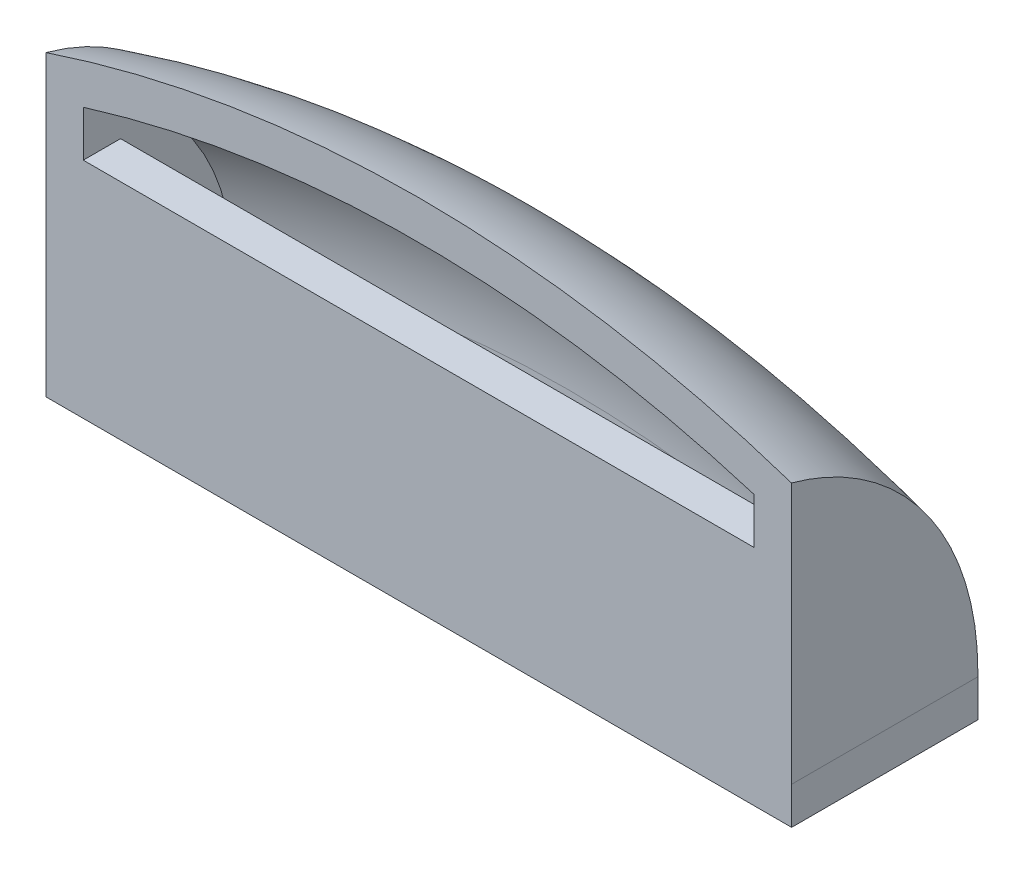
ISO-10303-21;
HEADER;
FILE_DESCRIPTION(('STEP AP214'),'2;1');
FILE_NAME('part.step','',(''),(''),'','','');
FILE_SCHEMA(('AUTOMOTIVE_DESIGN { 1 0 10303 214 1 1 1 1 }'));
ENDSEC;
DATA;
#1=APPLICATION_CONTEXT('core data for automotive mechanical design processes');
#2=APPLICATION_PROTOCOL_DEFINITION('international standard','automotive_design',2000,#1);
#3=PRODUCT_CONTEXT('',#1,'mechanical');
#4=PRODUCT('Part','Part','',(#3));
#5=PRODUCT_RELATED_PRODUCT_CATEGORY('part','',(#4));
#6=PRODUCT_DEFINITION_FORMATION('','',#4);
#7=PRODUCT_DEFINITION_CONTEXT('part definition',#1,'design');
#8=PRODUCT_DEFINITION('design','',#6,#7);
#9=PRODUCT_DEFINITION_SHAPE('','',#8);
#10=(LENGTH_UNIT() NAMED_UNIT(*) SI_UNIT(.MILLI.,.METRE.));
#11=(NAMED_UNIT(*) PLANE_ANGLE_UNIT() SI_UNIT($,.RADIAN.));
#12=(NAMED_UNIT(*) SI_UNIT($,.STERADIAN.) SOLID_ANGLE_UNIT());
#13=UNCERTAINTY_MEASURE_WITH_UNIT(LENGTH_MEASURE(1.E-05),#10,'distance_accuracy_value','');
#14=(GEOMETRIC_REPRESENTATION_CONTEXT(3) GLOBAL_UNCERTAINTY_ASSIGNED_CONTEXT((#13)) GLOBAL_UNIT_ASSIGNED_CONTEXT((#10,
#11,#12)) REPRESENTATION_CONTEXT('',''));
#15=CARTESIAN_POINT('',(0.,0.,0.));
#16=DIRECTION('',(0.,0.,1.));
#17=DIRECTION('',(1.,0.,0.));
#18=AXIS2_PLACEMENT_3D('',#15,#16,#17);
#19=CARTESIAN_POINT('',(-27.,75.,-25.));
#20=DIRECTION('',(1.,0.,0.));
#21=DIRECTION('',(0.,0.,-1.));
#22=AXIS2_PLACEMENT_3D('',#19,#20,#21);
#23=PLANE('',#22);
#24=DIRECTION('',(0.,1.,0.));
#25=VECTOR('',#24,1.);
#26=CARTESIAN_POINT('',(-27.,6.41436476288706,-10.));
#27=LINE('',#26,#25);
#28=CARTESIAN_POINT('',(-27.,90.,-10.));
#29=VERTEX_POINT('',#28);
#30=CARTESIAN_POINT('',(-27.,93.6919210733854,-10.));
#31=VERTEX_POINT('',#30);
#32=EDGE_CURVE('E426',#29,#31,#27,.T.);
#33=ORIENTED_EDGE('',*,*,#32,.F.);
#34=DIRECTION('',(0.,0.,1.));
#35=VECTOR('',#34,1.);
#36=CARTESIAN_POINT('',(-27.,90.,-25.));
#37=LINE('',#36,#35);
#38=CARTESIAN_POINT('',(-27.,90.,-13.));
#39=VERTEX_POINT('',#38);
#40=EDGE_CURVE('E429',#39,#29,#37,.T.);
#41=ORIENTED_EDGE('',*,*,#40,.F.);
#42=DIRECTION('',(0.,1.,0.));
#43=VECTOR('',#42,1.);
#44=CARTESIAN_POINT('',(-27.,75.,-13.));
#45=LINE('',#44,#43);
#46=CARTESIAN_POINT('',(-27.,78.,-13.));
#47=VERTEX_POINT('',#46);
#48=EDGE_CURVE('E421',#47,#39,#45,.T.);
#49=ORIENTED_EDGE('',*,*,#48,.F.);
#50=DIRECTION('',(0.,0.,1.));
#51=VECTOR('',#50,1.);
#52=CARTESIAN_POINT('',(-27.,78.,-25.));
#53=LINE('',#52,#51);
#54=CARTESIAN_POINT('',(-27.,78.,-21.9424375724654));
#55=VERTEX_POINT('',#54);
#56=EDGE_CURVE('E445',#55,#47,#53,.T.);
#57=ORIENTED_EDGE('',*,*,#56,.F.);
#58=CARTESIAN_POINT('',(-27.,93.6919210733854,-10.));
#59=CARTESIAN_POINT('',(-27.,93.619217219464,-10.2257068950183));
#60=CARTESIAN_POINT('',(-27.,93.5416318474032,-10.4498086800089));
#61=CARTESIAN_POINT('',(-27.,93.376862329942,-10.8944452056012));
#62=CARTESIAN_POINT('',(-27.,93.2896785735802,-11.11498009036));
#63=CARTESIAN_POINT('',(-27.,93.0140474152656,-11.7705344006446));
#64=CARTESIAN_POINT('',(-27.,92.8114559576739,-12.1997024041451));
#65=CARTESIAN_POINT('',(-27.,92.3709036193516,-13.0382016320841));
#66=CARTESIAN_POINT('',(-27.,92.133020854741,-13.4475740849002));
#67=CARTESIAN_POINT('',(-27.,91.6235484030225,-14.244803299333));
#68=CARTESIAN_POINT('',(-27.,91.3519576991253,-14.6326594114052));
#69=CARTESIAN_POINT('',(-27.,90.7774660705169,-15.3841327415115));
#70=CARTESIAN_POINT('',(-27.,90.4745800336131,-15.7477613508582));
#71=CARTESIAN_POINT('',(-27.,89.839806520689,-16.4487627542816));
#72=CARTESIAN_POINT('',(-27.,89.5079180895612,-16.7861346829806));
#73=CARTESIAN_POINT('',(-27.,88.8176879448799,-17.4326827015862));
#74=CARTESIAN_POINT('',(-27.,88.4593438371609,-17.7418562339424));
#75=CARTESIAN_POINT('',(-27.,87.7189050233827,-18.3303012762903));
#76=CARTESIAN_POINT('',(-27.,87.3368100171423,-18.6095724082319));
#77=CARTESIAN_POINT('',(-27.,86.5397873173074,-19.1447551441049));
#78=CARTESIAN_POINT('',(-27.,86.1242174957894,-19.3997104160725));
#79=CARTESIAN_POINT('',(-27.,85.2738182067326,-19.8751813038093));
#80=CARTESIAN_POINT('',(-27.,84.8389879082665,-20.0956954318721));
#81=CARTESIAN_POINT('',(-27.,83.9528905578594,-20.5014404681904));
#82=CARTESIAN_POINT('',(-27.,83.5016144924164,-20.6866516705655));
#83=CARTESIAN_POINT('',(-27.,82.5859146213674,-21.0209461565098));
#84=CARTESIAN_POINT('',(-27.,82.1214918206698,-21.1700321931259));
#85=CARTESIAN_POINT('',(-27.,81.2332400060126,-21.4175126709148));
#86=CARTESIAN_POINT('',(-27.,80.8104458949369,-21.5196434850414));
#87=CARTESIAN_POINT('',(-27.,79.9588637858552,-21.6946670524162));
#88=CARTESIAN_POINT('',(-27.,79.5300760448194,-21.767561055206));
#89=CARTESIAN_POINT('',(-27.,78.669385377977,-21.8839539905841));
#90=CARTESIAN_POINT('',(-27.,78.237490076371,-21.9275094738412));
#91=CARTESIAN_POINT('',(-27.,77.3717622157638,-21.9855404497158));
#92=CARTESIAN_POINT('',(-27.,76.937929721892,-22.0000169127175));
#93=CARTESIAN_POINT('',(-27.,76.5041118080434,-22.));
#94=B_SPLINE_CURVE_WITH_KNOTS('',3,(#58,#59,#60,#61,#62,#63,#64,#65,#66,#67,#68,#69,#70,#71,#72,
#73,#74,#75,#76,#77,#78,#79,#80,#81,#82,#83,#84,#85,#86,#87,#88,#89,#90,#91,#92,#93),
.UNSPECIFIED.,.F.,.F.,(4,2,2,2,2,2,2,2,2,2,2,2,2,2,2,2,2,4),(0.,0.711265521087366,
1.42250222399561,2.84435069189139,4.26309764826309,5.68188741108903,7.10000530834543,
8.51816992470458,9.9364630387256,11.3547740818162,12.8157829152158,14.2768548403428,
15.7387399538586,17.2005136241534,18.5043666925197,19.8081640300454,21.1094410213714,
22.4106745875885),.UNSPECIFIED.);
#95=EDGE_CURVE('E272',#31,#55,#94,.T.);
#96=ORIENTED_EDGE('',*,*,#95,.F.);
#97=EDGE_LOOP('',(#33,#41,#49,#57,#96));
#98=FACE_BOUND('',#97,.T.);
#99=ADVANCED_FACE('F37',(#98),#23,.T.);
#100=CARTESIAN_POINT('',(27.,75.,-25.));
#101=DIRECTION('',(-1.,0.,0.));
#102=DIRECTION('',(0.,0.,1.));
#103=AXIS2_PLACEMENT_3D('',#100,#101,#102);
#104=PLANE('',#103);
#105=DIRECTION('',(0.,-1.,0.));
#106=VECTOR('',#105,1.);
#107=CARTESIAN_POINT('',(27.,75.,-13.));
#108=LINE('',#107,#106);
#109=CARTESIAN_POINT('',(27.,90.,-13.));
#110=VERTEX_POINT('',#109);
#111=CARTESIAN_POINT('',(27.,78.,-13.));
#112=VERTEX_POINT('',#111);
#113=EDGE_CURVE('E424',#110,#112,#108,.T.);
#114=ORIENTED_EDGE('',*,*,#113,.F.);
#115=DIRECTION('',(0.,0.,-1.));
#116=VECTOR('',#115,1.);
#117=CARTESIAN_POINT('',(27.,90.,-25.));
#118=LINE('',#117,#116);
#119=CARTESIAN_POINT('',(27.,90.,-10.));
#120=VERTEX_POINT('',#119);
#121=EDGE_CURVE('E427',#120,#110,#118,.T.);
#122=ORIENTED_EDGE('',*,*,#121,.F.);
#123=DIRECTION('',(0.,-1.,0.));
#124=VECTOR('',#123,1.);
#125=CARTESIAN_POINT('',(27.,6.41436476288706,-10.));
#126=LINE('',#125,#124);
#127=CARTESIAN_POINT('',(27.,93.6919210733854,-10.));
#128=VERTEX_POINT('',#127);
#129=EDGE_CURVE('E63',#128,#120,#126,.T.);
#130=ORIENTED_EDGE('',*,*,#129,.F.);
#131=CARTESIAN_POINT('',(27.,76.5041118080434,-22.));
#132=CARTESIAN_POINT('',(27.,77.0346757917918,-22.0000333245405));
#133=CARTESIAN_POINT('',(27.,77.5652439063847,-21.9783710890752));
#134=CARTESIAN_POINT('',(27.,78.6229095243907,-21.8915178521918));
#135=CARTESIAN_POINT('',(27.,79.1500062905515,-21.8263178872294));
#136=CARTESIAN_POINT('',(27.,80.1979622909298,-21.6520962402332));
#137=CARTESIAN_POINT('',(27.,80.7188087276313,-21.5429966296942));
#138=CARTESIAN_POINT('',(27.,81.4915986506471,-21.3467077874211));
#139=CARTESIAN_POINT('',(27.,81.7477833054238,-21.275837818185));
#140=CARTESIAN_POINT('',(27.,82.2569773349279,-21.1232441960247));
#141=CARTESIAN_POINT('',(27.,82.5099857984201,-21.0415175028746));
#142=CARTESIAN_POINT('',(27.,83.264190862016,-20.7798980926446));
#143=CARTESIAN_POINT('',(27.,83.7598602925032,-20.5837451634038));
#144=CARTESIAN_POINT('',(27.,84.7321833192771,-20.1490560776574));
#145=CARTESIAN_POINT('',(27.,85.2088373479439,-19.910520885531));
#146=CARTESIAN_POINT('',(27.,86.1388667512204,-19.3924592004361));
#147=CARTESIAN_POINT('',(27.,86.5922603772987,-19.1129655311783));
#148=CARTESIAN_POINT('',(27.,87.4721677488499,-18.5144743849411));
#149=CARTESIAN_POINT('',(27.,87.8986834139673,-18.1954797339877));
#150=CARTESIAN_POINT('',(27.,88.7031427880431,-17.5346718201943));
#151=CARTESIAN_POINT('',(27.,89.0823896358479,-17.1944431379185));
#152=CARTESIAN_POINT('',(27.,89.8094500580473,-16.4818286977226));
#153=CARTESIAN_POINT('',(27.,90.157266028708,-16.1094453954862));
#154=CARTESIAN_POINT('',(27.,90.6528559009201,-15.5289196944014));
#155=CARTESIAN_POINT('',(27.,90.813676578912,-15.3317812114863));
#156=CARTESIAN_POINT('',(27.,91.1262647459645,-14.9305368303903));
#157=CARTESIAN_POINT('',(27.,91.2780347784153,-14.7264329152094));
#158=CARTESIAN_POINT('',(27.,91.7191995729419,-14.1042714568924));
#159=CARTESIAN_POINT('',(27.,91.9945996372107,-13.6761878939452));
#160=CARTESIAN_POINT('',(27.,92.5471996668486,-12.7243711892247));
#161=CARTESIAN_POINT('',(27.,92.8172761373544,-12.196471080731));
#162=CARTESIAN_POINT('',(27.,93.1785720370115,-11.3858187760741));
#163=CARTESIAN_POINT('',(27.,93.2916527838105,-11.1126166151735));
#164=CARTESIAN_POINT('',(27.,93.5029950332463,-10.560447545539));
#165=CARTESIAN_POINT('',(27.,93.6012521599434,-10.2814789620797));
#166=CARTESIAN_POINT('',(27.,93.6919210733854,-9.99999999999999));
#167=B_SPLINE_CURVE_WITH_KNOTS('',3,(#131,#132,#133,#134,#135,#136,#137,#138,#139,#140,#141,
#142,#143,#144,#145,#146,#147,#148,#149,#150,#151,#152,#153,#154,#155,#156,#157,#158,#159,#160,
#161,#162,#163,#164,#165,#166),.UNSPECIFIED.,.F.,.F.,(4,2,2,2,2,2,2,2,2,2,2,2,2,2,2,2,2,4),(0.,
1.5912406810534,3.18280906765717,4.77721528130844,5.57442663064602,6.37186169683393,
7.96891216325808,9.56592629455348,11.1616675235869,12.7572946540973,14.2838800173625,
15.8103488965604,16.5733740664691,17.3361837925554,18.8611102495762,20.6363229684173,
21.5229949982962,22.4099282641586),.UNSPECIFIED.);
#168=CARTESIAN_POINT('',(27.,78.,-21.9424375724654));
#169=VERTEX_POINT('',#168);
#170=EDGE_CURVE('E281',#169,#128,#167,.T.);
#171=ORIENTED_EDGE('',*,*,#170,.F.);
#172=DIRECTION('',(0.,0.,1.));
#173=VECTOR('',#172,1.);
#174=CARTESIAN_POINT('',(27.,78.,-25.));
#175=LINE('',#174,#173);
#176=EDGE_CURVE('E289',#169,#112,#175,.T.);
#177=ORIENTED_EDGE('',*,*,#176,.T.);
#178=EDGE_LOOP('',(#114,#122,#130,#171,#177));
#179=FACE_BOUND('',#178,.T.);
#180=ADVANCED_FACE('F292',(#179),#104,.T.);
#181=CARTESIAN_POINT('',(0.,78.,-25.));
#182=DIRECTION('',(0.,1.,0.));
#183=DIRECTION('',(0.,0.,1.));
#184=AXIS2_PLACEMENT_3D('',#181,#182,#183);
#185=PLANE('',#184);
#186=CARTESIAN_POINT('',(24.,78.,-19.1524035055864));
#187=DIRECTION('',(0.,-1.,0.));
#188=DIRECTION('',(0.,0.,-1.));
#189=AXIS2_PLACEMENT_3D('',#186,#187,#188);
#190=CIRCLE('',#189,2.5);
#191=CARTESIAN_POINT('',(24.,78.,-21.6524035055864));
#192=VERTEX_POINT('',#191);
#193=EDGE_CURVE('E377',#192,#192,#190,.T.);
#194=ORIENTED_EDGE('',*,*,#193,.T.);
#195=EDGE_LOOP('',(#194));
#196=FACE_BOUND('',#195,.T.);
#197=CARTESIAN_POINT('',(16.,78.,-19.1524035055864));
#198=DIRECTION('',(0.,-1.,0.));
#199=DIRECTION('',(0.,0.,-1.));
#200=AXIS2_PLACEMENT_3D('',#197,#198,#199);
#201=CIRCLE('',#200,2.5);
#202=CARTESIAN_POINT('',(16.,78.,-21.6524035055864));
#203=VERTEX_POINT('',#202);
#204=EDGE_CURVE('E410',#203,#203,#201,.T.);
#205=ORIENTED_EDGE('',*,*,#204,.T.);
#206=EDGE_LOOP('',(#205));
#207=FACE_BOUND('',#206,.T.);
#208=CARTESIAN_POINT('',(-8.,78.,-19.1524035055865));
#209=DIRECTION('',(0.,-1.,0.));
#210=DIRECTION('',(0.,0.,-1.));
#211=AXIS2_PLACEMENT_3D('',#208,#209,#210);
#212=CIRCLE('',#211,2.5);
#213=CARTESIAN_POINT('',(-8.,78.,-21.6524035055865));
#214=VERTEX_POINT('',#213);
#215=EDGE_CURVE('E400',#214,#214,#212,.T.);
#216=ORIENTED_EDGE('',*,*,#215,.T.);
#217=EDGE_LOOP('',(#216));
#218=FACE_BOUND('',#217,.T.);
#219=CARTESIAN_POINT('',(-16.,78.,-19.1524035055865));
#220=DIRECTION('',(0.,-1.,0.));
#221=DIRECTION('',(0.,0.,-1.));
#222=AXIS2_PLACEMENT_3D('',#219,#220,#221);
#223=CIRCLE('',#222,2.5);
#224=CARTESIAN_POINT('',(-16.,78.,-21.6524035055865));
#225=VERTEX_POINT('',#224);
#226=EDGE_CURVE('E385',#225,#225,#223,.T.);
#227=ORIENTED_EDGE('',*,*,#226,.T.);
#228=EDGE_LOOP('',(#227));
#229=FACE_BOUND('',#228,.T.);
#230=CARTESIAN_POINT('',(-24.,78.,-19.1524035055866));
#231=DIRECTION('',(0.,-1.,0.));
#232=DIRECTION('',(0.,0.,-1.));
#233=AXIS2_PLACEMENT_3D('',#230,#231,#232);
#234=CIRCLE('',#233,2.5);
#235=CARTESIAN_POINT('',(-24.,78.,-21.6524035055866));
#236=VERTEX_POINT('',#235);
#237=EDGE_CURVE('E386',#236,#236,#234,.T.);
#238=ORIENTED_EDGE('',*,*,#237,.T.);
#239=EDGE_LOOP('',(#238));
#240=FACE_BOUND('',#239,.T.);
#241=CARTESIAN_POINT('',(8.,78.,-19.1524035055864));
#242=DIRECTION('',(0.,-1.,0.));
#243=DIRECTION('',(0.,0.,-1.));
#244=AXIS2_PLACEMENT_3D('',#241,#242,#243);
#245=CIRCLE('',#244,2.5);
#246=CARTESIAN_POINT('',(8.,78.,-21.6524035055864));
#247=VERTEX_POINT('',#246);
#248=EDGE_CURVE('E392',#247,#247,#245,.T.);
#249=ORIENTED_EDGE('',*,*,#248,.T.);
#250=EDGE_LOOP('',(#249));
#251=FACE_BOUND('',#250,.T.);
#252=CARTESIAN_POINT('',(0.,78.,-19.1524035055864));
#253=DIRECTION('',(0.,-1.,0.));
#254=DIRECTION('',(0.,0.,-1.));
#255=AXIS2_PLACEMENT_3D('',#252,#253,#254);
#256=CIRCLE('',#255,2.5);
#257=CARTESIAN_POINT('',(0.,78.,-21.6524035055864));
#258=VERTEX_POINT('',#257);
#259=EDGE_CURVE('E418',#258,#258,#256,.T.);
#260=ORIENTED_EDGE('',*,*,#259,.T.);
#261=EDGE_LOOP('',(#260));
#262=FACE_BOUND('',#261,.T.);
#263=ORIENTED_EDGE('',*,*,#56,.T.);
#264=DIRECTION('',(1.,0.,0.));
#265=VECTOR('',#264,1.);
#266=CARTESIAN_POINT('',(0.,78.,-13.));
#267=LINE('',#266,#265);
#268=EDGE_CURVE('E11',#47,#112,#267,.T.);
#269=ORIENTED_EDGE('',*,*,#268,.T.);
#270=ORIENTED_EDGE('',*,*,#176,.F.);
#271=CARTESIAN_POINT('',(-40.4373796665936,78.,-20.4431854967379));
#272=CARTESIAN_POINT('',(-40.0745835027086,78.,-20.5252958430657));
#273=CARTESIAN_POINT('',(-39.7108244496125,78.,-20.6030500567686));
#274=CARTESIAN_POINT('',(-38.9816813721348,78.,-20.7503711048823));
#275=CARTESIAN_POINT('',(-38.6162974849392,78.,-20.8199386173759));
#276=CARTESIAN_POINT('',(-37.5184518772257,78.,-21.0170988492007));
#277=CARTESIAN_POINT('',(-36.7839164573891,78.,-21.1332339681303));
#278=CARTESIAN_POINT('',(-35.3130438388249,78.,-21.3385459535695));
#279=CARTESIAN_POINT('',(-34.5767158016866,78.,-21.4277898087633));
#280=CARTESIAN_POINT('',(-33.1015596483565,78.,-21.5832576928411));
#281=CARTESIAN_POINT('',(-32.3627312014544,78.,-21.649478546078));
#282=CARTESIAN_POINT('',(-30.88468059877,78.,-21.7620572424267));
#283=CARTESIAN_POINT('',(-30.1454606018707,78.,-21.808444015093));
#284=CARTESIAN_POINT('',(-28.6661438096076,78.,-21.8845027307482));
#285=CARTESIAN_POINT('',(-27.9260469703664,78.,-21.9141737985298));
#286=CARTESIAN_POINT('',(-26.4448991899436,78.,-21.959612491081));
#287=CARTESIAN_POINT('',(-25.7038479473313,78.,-21.9753698791841));
#288=CARTESIAN_POINT('',(-24.2215833647041,78.,-21.9955638844467));
#289=CARTESIAN_POINT('',(-23.4803700207509,78.,-22.0000001864451));
#290=CARTESIAN_POINT('',(-22.0312490408585,78.,-21.9999998219302));
#291=CARTESIAN_POINT('',(-21.3233409758596,78.,-21.9959527873187));
#292=CARTESIAN_POINT('',(-19.9075845282182,78.,-21.9817599995771));
#293=CARTESIAN_POINT('',(-19.1997361462037,78.,-21.9716141887396));
#294=CARTESIAN_POINT('',(-17.7840857123658,78.,-21.9470848357499));
#295=CARTESIAN_POINT('',(-17.0762836638885,78.,-21.9327011096092));
#296=CARTESIAN_POINT('',(-15.6607359380111,78.,-21.9014182586534));
#297=CARTESIAN_POINT('',(-14.9529902607036,78.,-21.8845191297796));
#298=CARTESIAN_POINT('',(-13.5378644710592,78.,-21.8497867413899));
#299=CARTESIAN_POINT('',(-12.8304843472355,78.,-21.8319539369174));
#300=CARTESIAN_POINT('',(-11.4157124154307,78.,-21.7967537671303));
#301=CARTESIAN_POINT('',(-10.708320607453,78.,-21.7793864016864));
#302=CARTESIAN_POINT('',(-9.29351781522365,78.,-21.7463434626295));
#303=CARTESIAN_POINT('',(-8.58610683218487,78.,-21.730667838253));
#304=CARTESIAN_POINT('',(-7.17122903076485,78.,-21.7020327754913));
#305=CARTESIAN_POINT('',(-6.46376221240883,78.,-21.6890733358865));
#306=CARTESIAN_POINT('',(-5.04758799728329,78.,-21.6666565863968));
#307=CARTESIAN_POINT('',(-4.33888050525951,78.,-21.6572051721121));
#308=CARTESIAN_POINT('',(-2.92142199750249,78.,-21.6424043715684));
#309=CARTESIAN_POINT('',(-2.21267098177971,78.,-21.6370549843267));
#310=CARTESIAN_POINT('',(-0.795152250450454,78.,-21.6307742494973));
#311=CARTESIAN_POINT('',(-0.0863845349359149,78.,-21.629842881563));
#312=CARTESIAN_POINT('',(1.33114253001846,78.,-21.6324527243402));
#313=CARTESIAN_POINT('',(2.03990187945791,78.,-21.6359939352548));
#314=CARTESIAN_POINT('',(3.45807947784727,78.,-21.647346269665));
#315=CARTESIAN_POINT('',(4.16749769270408,78.,-21.6551615691433));
#316=CARTESIAN_POINT('',(5.58628114775214,78.,-21.6745977388534));
#317=CARTESIAN_POINT('',(6.29564638792651,78.,-21.6862186102929));
#318=CARTESIAN_POINT('',(7.71434243982659,78.,-21.7125524060677));
#319=CARTESIAN_POINT('',(8.42367324955509,78.,-21.7272654357669));
#320=CARTESIAN_POINT('',(9.8422863302596,78.,-21.7588388265653));
#321=CARTESIAN_POINT('',(10.5515686012133,78.,-21.7756991886476));
#322=CARTESIAN_POINT('',(11.9756026822028,78.,-21.8105462611486));
#323=CARTESIAN_POINT('',(12.6903542988448,78.,-21.8285406851236));
#324=CARTESIAN_POINT('',(14.1198672909939,78.,-21.8641581484936));
#325=CARTESIAN_POINT('',(14.8346286665045,78.,-21.8817811877526));
#326=CARTESIAN_POINT('',(16.2641465271401,78.,-21.9150983693796));
#327=CARTESIAN_POINT('',(16.9789030089372,78.,-21.930792650041));
#328=CARTESIAN_POINT('',(18.4084889262717,78.,-21.9585371987073));
#329=CARTESIAN_POINT('',(19.1233183617254,78.,-21.9705874708487));
#330=CARTESIAN_POINT('',(20.55098426064,78.,-21.9891521962113));
#331=CARTESIAN_POINT('',(21.2638205027654,78.,-21.9956825745991));
#332=CARTESIAN_POINT('',(22.6895204408151,78.,-22.0012778156343));
#333=CARTESIAN_POINT('',(23.4023841362786,78.,-22.000342772625));
#334=CARTESIAN_POINT('',(24.8283153563948,78.,-21.9888790111914));
#335=CARTESIAN_POINT('',(25.5413828554702,78.,-21.978346644613));
#336=CARTESIAN_POINT('',(26.9672384229693,78.,-21.9454124857918));
#337=CARTESIAN_POINT('',(27.6800264980781,78.,-21.923010997356));
#338=CARTESIAN_POINT('',(29.1066965284859,78.,-21.8638460878125));
#339=CARTESIAN_POINT('',(29.8205771330828,78.,-21.8270491351855));
#340=CARTESIAN_POINT('',(31.2472696706322,78.,-21.7364857233503));
#341=CARTESIAN_POINT('',(31.9600816228532,78.,-21.6827195738962));
#342=CARTESIAN_POINT('',(33.3832694667586,78.,-21.5554767840078));
#343=CARTESIAN_POINT('',(34.0936470588481,78.,-21.4820194667438));
#344=CARTESIAN_POINT('',(35.5116717754108,78.,-21.3123618881089));
#345=CARTESIAN_POINT('',(36.2193190597525,78.,-21.2161629795217));
#346=CARTESIAN_POINT('',(37.6387905994659,78.,-20.996491474965));
#347=CARTESIAN_POINT('',(38.3505686654758,78.,-20.8727166363303));
#348=CARTESIAN_POINT('',(39.7680678387482,78.,-20.5949066350063));
#349=CARTESIAN_POINT('',(40.4737903298521,78.,-20.4408785890794));
#350=CARTESIAN_POINT('',(41.8796774538019,78.,-20.0978532603501));
#351=CARTESIAN_POINT('',(42.5798104912421,78.,-19.9087244384741));
#352=CARTESIAN_POINT('',(43.6214775022799,78.,-19.5957107091333));
#353=CARTESIAN_POINT('',(43.9674303146966,78.,-19.4864306964832));
#354=CARTESIAN_POINT('',(44.6559332965782,78.,-19.2574820554594));
#355=CARTESIAN_POINT('',(44.9984829619861,78.,-19.1378119129822));
#356=CARTESIAN_POINT('',(45.3390555863682,78.,-19.0126481347996));
#357=B_SPLINE_CURVE_WITH_KNOTS('',3,(#271,#272,#273,#274,#275,#276,#277,#278,#279,#280,#281,
#282,#283,#284,#285,#286,#287,#288,#289,#290,#291,#292,#293,#294,#295,#296,#297,#298,#299,#300,
#301,#302,#303,#304,#305,#306,#307,#308,#309,#310,#311,#312,#313,#314,#315,#316,#317,#318,#319,
#320,#321,#322,#323,#324,#325,#326,#327,#328,#329,#330,#331,#332,#333,#334,#335,#336,#337,#338,
#339,#340,#341,#342,#343,#344,#345,#346,#347,#348,#349,#350,#351,#352,#353,#354,#355,#356),
.UNSPECIFIED.,.F.,.F.,(4,2,2,2,2,2,2,2,2,2,2,2,2,2,2,2,2,2,2,2,2,2,2,2,2,2,2,2,2,2,2,2,2,2,2,2,
2,2,2,2,2,2,4),(0.,1.11585212317936,2.23161175813276,4.4619647634316,6.68671492042735,
8.9117718237363,11.1335721443637,13.3554887840462,15.5790387884526,17.8026506922791,
19.926375389799,22.0501201825891,24.1739571910778,26.2977976265646,28.420612435101,
30.5434266537497,32.6661771560454,34.7889267051475,36.9152277725809,39.0415283305989,
41.1678190962463,43.2941099584706,45.4224820267581,47.5508547705682,49.6793000494871,
51.8077463028468,53.952680712389,56.0976159080501,58.242397220411,60.3871760981218,
62.5257458549372,64.6642885859012,66.8036445633367,68.9429457835887,71.087260059946,
73.2315351964609,75.3737137855319,77.5157649791314,79.6825624006486,81.8488507140414,
84.0234273412915,85.1116879487829,86.2001074102602),.UNSPECIFIED.);
#358=CARTESIAN_POINT('',(22.7391615622259,78.,-22.));
#359=VERTEX_POINT('',#358);
#360=EDGE_CURVE('E303',#359,#169,#357,.T.);
#361=ORIENTED_EDGE('',*,*,#360,.F.);
#362=DIRECTION('',(-1.,0.,0.));
#363=VECTOR('',#362,1.);
#364=CARTESIAN_POINT('',(0.,78.,-22.));
#365=LINE('',#364,#363);
#366=CARTESIAN_POINT('',(-22.7391615622259,78.,-22.));
#367=VERTEX_POINT('',#366);
#368=EDGE_CURVE('E451',#359,#367,#365,.T.);
#369=ORIENTED_EDGE('',*,*,#368,.T.);
#370=EDGE_CURVE('E310',#55,#367,#357,.T.);
#371=ORIENTED_EDGE('',*,*,#370,.F.);
#372=EDGE_LOOP('',(#263,#269,#270,#361,#369,#371));
#373=FACE_BOUND('',#372,.T.);
#374=ADVANCED_FACE('F296',(#196,#207,#218,#229,#240,#251,#262,#373),#185,.T.);
#375=CARTESIAN_POINT('',(-30.,75.,-25.));
#376=DIRECTION('',(1.,0.,0.));
#377=DIRECTION('',(0.,0.,-1.));
#378=AXIS2_PLACEMENT_3D('',#375,#376,#377);
#379=PLANE('',#378);
#380=DIRECTION('',(0.,1.,0.));
#381=VECTOR('',#380,1.);
#382=CARTESIAN_POINT('',(-30.,75.,-10.));
#383=LINE('',#382,#381);
#384=CARTESIAN_POINT('',(-30.,72.,-10.));
#385=VERTEX_POINT('',#384);
#386=CARTESIAN_POINT('',(-30.,96.,-10.));
#387=VERTEX_POINT('',#386);
#388=EDGE_CURVE('E318',#385,#387,#383,.T.);
#389=ORIENTED_EDGE('',*,*,#388,.T.);
#390=CARTESIAN_POINT('',(-30.,96.,-10.));
#391=CARTESIAN_POINT('',(-30.,95.9272843587624,-10.267054467892));
#392=CARTESIAN_POINT('',(-30.,95.8487812178515,-10.5324982919286));
#393=CARTESIAN_POINT('',(-30.,95.6803759047896,-11.0597334048184));
#394=CARTESIAN_POINT('',(-30.,95.5904741965683,-11.3215248418454));
#395=CARTESIAN_POINT('',(-30.,95.3040113372372,-12.1005729019031));
#396=CARTESIAN_POINT('',(-30.,95.0906268372256,-12.6117438451124));
#397=CARTESIAN_POINT('',(-30.,94.6214767222097,-13.6128518031679));
#398=CARTESIAN_POINT('',(-30.,94.3658060350915,-14.1028333462248));
#399=CARTESIAN_POINT('',(-30.,93.9520397448517,-14.8201725820242));
#400=CARTESIAN_POINT('',(-30.,93.8090636258165,-15.0563621232062));
#401=CARTESIAN_POINT('',(-30.,93.5132767406698,-15.5225792993039));
#402=CARTESIAN_POINT('',(-30.,93.3604636561917,-15.7526054634167));
#403=CARTESIAN_POINT('',(-30.,92.8880051471077,-16.4324781981741));
#404=CARTESIAN_POINT('',(-30.,92.554105914538,-16.8725250859767));
#405=CARTESIAN_POINT('',(-30.,91.851124952213,-17.723555811852));
#406=CARTESIAN_POINT('',(-30.,91.4820419125056,-18.1345385668251));
#407=CARTESIAN_POINT('',(-30.,90.9043130009514,-18.7273843977736));
#408=CARTESIAN_POINT('',(-30.,90.7076885950296,-18.9210883905472));
#409=CARTESIAN_POINT('',(-30.,90.3068161695663,-19.3003325534084));
#410=CARTESIAN_POINT('',(-30.,90.1025701449409,-19.485874832458));
#411=CARTESIAN_POINT('',(-30.,89.4788511487687,-20.0299964948971));
#412=CARTESIAN_POINT('',(-30.,89.0483755206115,-20.3760929760081));
#413=CARTESIAN_POINT('',(-30.,88.1471439789817,-21.0436962987804));
#414=CARTESIAN_POINT('',(-30.,87.6755367429274,-21.3640501440856));
#415=CARTESIAN_POINT('',(-30.,86.7080962737381,-21.9658311534647));
#416=CARTESIAN_POINT('',(-30.,86.2122624815343,-22.2472574186442));
#417=CARTESIAN_POINT('',(-30.,85.1994301474438,-22.7702799368788));
#418=CARTESIAN_POINT('',(-30.,84.6824110122981,-23.0118362299665));
#419=CARTESIAN_POINT('',(-30.,83.6310712455219,-23.4540048264665));
#420=CARTESIAN_POINT('',(-30.,83.0967494350217,-23.6546143332544));
#421=CARTESIAN_POINT('',(-30.,82.262501201253,-23.9318739537644));
#422=CARTESIAN_POINT('',(-30.,81.967369594489,-24.0232012377724));
#423=CARTESIAN_POINT('',(-30.,81.3736724002996,-24.1936247366981));
#424=CARTESIAN_POINT('',(-30.,81.0751076219679,-24.2727237724463));
#425=CARTESIAN_POINT('',(-30.,80.1748109914703,-24.4916920640192));
#426=CARTESIAN_POINT('',(-30.,79.5685149360106,-24.6132198796222));
#427=CARTESIAN_POINT('',(-30.,78.3492124147324,-24.8071305508758));
#428=CARTESIAN_POINT('',(-30.,77.7362182472481,-24.8795917812271));
#429=CARTESIAN_POINT('',(-30.,76.5066225924859,-24.9760350570654));
#430=CARTESIAN_POINT('',(-30.,75.8900223604652,-25.0000330696926));
#431=CARTESIAN_POINT('',(-30.,75.2734428924554,-25.));
#432=B_SPLINE_CURVE_WITH_KNOTS('',3,(#390,#391,#392,#393,#394,#395,#396,#397,#398,#399,#400,
#401,#402,#403,#404,#405,#406,#407,#408,#409,#410,#411,#412,#413,#414,#415,#416,#417,#418,#419,
#420,#421,#422,#423,#424,#425,#426,#427,#428,#429,#430,#431),.UNSPECIFIED.,.F.,.F.,(4,2,2,2,2,2,
2,2,2,2,2,2,2,2,2,2,2,2,2,2,4),(0.,0.830200604503695,1.66036743010463,3.31995555233074,
4.97586742623799,5.80393487959208,6.63219821070533,8.28732254906213,9.94250853455626,
10.7703452135121,11.5979667101223,13.2531166191606,14.961645765912,16.6702143585071,
18.3804851124916,20.0908726371922,21.0174574643832,21.9438282256395,23.7966897732162,
25.6465846948834,27.4958700335488),.UNSPECIFIED.);
#433=CARTESIAN_POINT('',(-30.,75.2734428924554,-25.));
#434=VERTEX_POINT('',#433);
#435=EDGE_CURVE('E47',#387,#434,#432,.T.);
#436=ORIENTED_EDGE('',*,*,#435,.T.);
#437=DIRECTION('',(0.,1.,0.));
#438=VECTOR('',#437,1.);
#439=CARTESIAN_POINT('',(-30.,75.,-25.));
#440=LINE('',#439,#438);
#441=CARTESIAN_POINT('',(-30.,72.,-25.));
#442=VERTEX_POINT('',#441);
#443=EDGE_CURVE('E313',#442,#434,#440,.T.);
#444=ORIENTED_EDGE('',*,*,#443,.F.);
#445=DIRECTION('',(0.,0.,-1.));
#446=VECTOR('',#445,1.);
#447=CARTESIAN_POINT('',(-30.,72.,-25.));
#448=LINE('',#447,#446);
#449=EDGE_CURVE('E166',#385,#442,#448,.T.);
#450=ORIENTED_EDGE('',*,*,#449,.F.);
#451=EDGE_LOOP('',(#389,#436,#444,#450));
#452=FACE_BOUND('',#451,.T.);
#453=ADVANCED_FACE('F300',(#452),#379,.F.);
#454=CARTESIAN_POINT('',(30.,75.,-25.));
#455=DIRECTION('',(-1.,0.,0.));
#456=DIRECTION('',(0.,0.,1.));
#457=AXIS2_PLACEMENT_3D('',#454,#455,#456);
#458=PLANE('',#457);
#459=DIRECTION('',(0.,-1.,0.));
#460=VECTOR('',#459,1.);
#461=CARTESIAN_POINT('',(30.,75.,-25.));
#462=LINE('',#461,#460);
#463=CARTESIAN_POINT('',(30.,75.2734428924554,-25.));
#464=VERTEX_POINT('',#463);
#465=CARTESIAN_POINT('',(30.0045510411343,75.,-25.));
#466=VERTEX_POINT('',#465);
#467=EDGE_CURVE('E316',#464,#466,#462,.T.);
#468=ORIENTED_EDGE('',*,*,#467,.F.);
#469=CARTESIAN_POINT('',(30.,75.2734428924554,-25.));
#470=CARTESIAN_POINT('',(30.,75.9125833850177,-25.0000461212636));
#471=CARTESIAN_POINT('',(30.,76.5517874736002,-24.9742508507845));
#472=CARTESIAN_POINT('',(30.,77.8261373276366,-24.8705855867161));
#473=CARTESIAN_POINT('',(30.,78.4612818504508,-24.7927003529984));
#474=CARTESIAN_POINT('',(30.,79.7245890523722,-24.5841918591141));
#475=CARTESIAN_POINT('',(30.,80.3527292671145,-24.4534319150299));
#476=CARTESIAN_POINT('',(30.,81.5956419810234,-24.1391976687326));
#477=CARTESIAN_POINT('',(30.,82.2104157954191,-23.9557285784849));
#478=CARTESIAN_POINT('',(30.,83.4231963080404,-23.5359862922388));
#479=CARTESIAN_POINT('',(30.,84.0211636488716,-23.2995991669908));
#480=CARTESIAN_POINT('',(30.,85.1940132063754,-22.7750577997248));
#481=CARTESIAN_POINT('',(30.,85.7688943703563,-22.4869012003756));
#482=CARTESIAN_POINT('',(30.,86.8898429938055,-21.8605217338456));
#483=CARTESIAN_POINT('',(30.,87.4359436844351,-21.5223584042264));
#484=CARTESIAN_POINT('',(30.,88.4949860196379,-20.7975951846309));
#485=CARTESIAN_POINT('',(30.,89.0079304829827,-20.4109994203625));
#486=CARTESIAN_POINT('',(30.,89.967496640399,-19.6152120554492));
#487=CARTESIAN_POINT('',(30.,90.4162326406905,-19.2085684338981));
#488=CARTESIAN_POINT('',(30.,91.2757732891744,-18.3569171216855));
#489=CARTESIAN_POINT('',(30.,91.6865768249499,-17.9119083066564));
#490=CARTESIAN_POINT('',(30.,92.4661038632359,-16.9868674499107));
#491=CARTESIAN_POINT('',(30.,92.8348506746589,-16.5068550523052));
#492=CARTESIAN_POINT('',(30.,93.5268384602445,-15.5151723870567));
#493=CARTESIAN_POINT('',(30.,93.8500919822299,-15.0035109050384));
#494=CARTESIAN_POINT('',(30.,94.3491915786364,-14.1260206461913));
#495=CARTESIAN_POINT('',(30.,94.5384864493072,-13.7677676667588));
#496=CARTESIAN_POINT('',(30.,94.8943309938252,-13.040147553237));
#497=CARTESIAN_POINT('',(30.,95.0608829369358,-12.670781532489));
#498=CARTESIAN_POINT('',(30.,95.3703235530554,-11.9225953483197));
#499=CARTESIAN_POINT('',(30.,95.5132298982281,-11.5437824911378));
#500=CARTESIAN_POINT('',(30.,95.7749055477775,-10.7777811864059));
#501=CARTESIAN_POINT('',(30.,95.8936674004612,-10.3905901937895));
#502=CARTESIAN_POINT('',(30.,96.,-10.));
#503=B_SPLINE_CURVE_WITH_KNOTS('',3,(#469,#470,#471,#472,#473,#474,#475,#476,#477,#478,#479,
#480,#481,#482,#483,#484,#485,#486,#487,#488,#489,#490,#491,#492,#493,#494,#495,#496,#497,#498,
#499,#500,#501,#502),.UNSPECIFIED.,.F.,.F.,(4,2,2,2,2,2,2,2,2,2,2,2,2,2,2,2,4),(0.,
1.91699649322464,3.83455409378914,5.75710069876071,7.67945726462377,9.60599304287678,
11.5326165684827,13.4569644711472,15.3811485599152,17.1955397046805,19.0099840418488,
20.8234178300607,22.6363504580052,23.8511981625836,25.0659245623276,26.2797389628265,
27.4939274149686),.UNSPECIFIED.);
#504=CARTESIAN_POINT('',(30.,96.,-10.));
#505=VERTEX_POINT('',#504);
#506=EDGE_CURVE('E326',#464,#505,#503,.T.);
#507=ORIENTED_EDGE('',*,*,#506,.T.);
#508=DIRECTION('',(0.,-1.,0.));
#509=VECTOR('',#508,1.);
#510=CARTESIAN_POINT('',(30.,75.,-10.));
#511=LINE('',#510,#509);
#512=CARTESIAN_POINT('',(30.0045510411343,75.,-10.));
#513=VERTEX_POINT('',#512);
#514=EDGE_CURVE('E317',#505,#513,#511,.T.);
#515=ORIENTED_EDGE('',*,*,#514,.T.);
#516=CARTESIAN_POINT('',(30.0091020822686,75.,-25.));
#517=DIRECTION('',(0.,0.,1.));
#518=VECTOR('',#517,1.);
#519=LINE('',#516,#518);
#520=EDGE_CURVE('E206',#466,#513,#519,.T.);
#521=ORIENTED_EDGE('',*,*,#520,.F.);
#522=EDGE_LOOP('',(#468,#507,#515,#521));
#523=FACE_BOUND('',#522,.T.);
#524=ADVANCED_FACE('F337',(#523),#458,.F.);
#525=CARTESIAN_POINT('',(0.,75.,-25.));
#526=DIRECTION('',(0.,1.,0.));
#527=DIRECTION('',(0.,0.,1.));
#528=AXIS2_PLACEMENT_3D('',#525,#526,#527);
#529=PLANE('',#528);
#530=DIRECTION('',(-1.,0.,0.));
#531=VECTOR('',#530,1.);
#532=CARTESIAN_POINT('',(-26.6611253378978,75.,-13.75));
#533=LINE('',#532,#531);
#534=CARTESIAN_POINT('',(26.550879542849,75.,-13.75));
#535=VERTEX_POINT('',#534);
#536=CARTESIAN_POINT('',(-26.6611253378978,75.,-13.75));
#537=VERTEX_POINT('',#536);
#538=EDGE_CURVE('E159',#535,#537,#533,.T.);
#539=ORIENTED_EDGE('',*,*,#538,.T.);
#540=DIRECTION('',(0.,0.,-1.));
#541=VECTOR('',#540,1.);
#542=CARTESIAN_POINT('',(-26.6611253378978,75.,-13.75));
#543=LINE('',#542,#541);
#544=CARTESIAN_POINT('',(-26.6611253378978,75.,-21.75));
#545=VERTEX_POINT('',#544);
#546=EDGE_CURVE('E178',#537,#545,#543,.T.);
#547=ORIENTED_EDGE('',*,*,#546,.T.);
#548=DIRECTION('',(1.,0.,0.));
#549=VECTOR('',#548,1.);
#550=CARTESIAN_POINT('',(-26.6611253378978,75.,-21.75));
#551=LINE('',#550,#549);
#552=CARTESIAN_POINT('',(26.550879542849,75.,-21.75));
#553=VERTEX_POINT('',#552);
#554=EDGE_CURVE('E165',#545,#553,#551,.T.);
#555=ORIENTED_EDGE('',*,*,#554,.T.);
#556=DIRECTION('',(0.,0.,1.));
#557=VECTOR('',#556,1.);
#558=CARTESIAN_POINT('',(26.550879542849,75.,-13.75));
#559=LINE('',#558,#557);
#560=EDGE_CURVE('E181',#553,#535,#559,.T.);
#561=ORIENTED_EDGE('',*,*,#560,.T.);
#562=EDGE_LOOP('',(#539,#547,#555,#561));
#563=FACE_BOUND('',#562,.T.);
#564=CARTESIAN_POINT('',(24.,75.,-19.1524035055864));
#565=DIRECTION('',(0.,-1.,0.));
#566=DIRECTION('',(0.,0.,-1.));
#567=AXIS2_PLACEMENT_3D('',#564,#565,#566);
#568=CIRCLE('',#567,2.5);
#569=CARTESIAN_POINT('',(24.,75.,-21.6524035055864));
#570=VERTEX_POINT('',#569);
#571=EDGE_CURVE('E413',#570,#570,#568,.T.);
#572=ORIENTED_EDGE('',*,*,#571,.F.);
#573=EDGE_LOOP('',(#572));
#574=FACE_BOUND('',#573,.T.);
#575=CARTESIAN_POINT('',(16.,75.,-19.1524035055864));
#576=DIRECTION('',(0.,-1.,0.));
#577=DIRECTION('',(0.,0.,-1.));
#578=AXIS2_PLACEMENT_3D('',#575,#576,#577);
#579=CIRCLE('',#578,2.5);
#580=CARTESIAN_POINT('',(16.,75.,-21.6524035055864));
#581=VERTEX_POINT('',#580);
#582=EDGE_CURVE('E395',#581,#581,#579,.T.);
#583=ORIENTED_EDGE('',*,*,#582,.F.);
#584=EDGE_LOOP('',(#583));
#585=FACE_BOUND('',#584,.T.);
#586=CARTESIAN_POINT('',(-8.,75.,-19.1524035055865));
#587=DIRECTION('',(0.,-1.,0.));
#588=DIRECTION('',(0.,0.,-1.));
#589=AXIS2_PLACEMENT_3D('',#586,#587,#588);
#590=CIRCLE('',#589,2.5);
#591=CARTESIAN_POINT('',(-8.,75.,-21.6524035055865));
#592=VERTEX_POINT('',#591);
#593=EDGE_CURVE('E396',#592,#592,#590,.T.);
#594=ORIENTED_EDGE('',*,*,#593,.F.);
#595=EDGE_LOOP('',(#594));
#596=FACE_BOUND('',#595,.T.);
#597=CARTESIAN_POINT('',(-16.,75.,-19.1524035055865));
#598=DIRECTION('',(0.,-1.,0.));
#599=DIRECTION('',(0.,0.,-1.));
#600=AXIS2_PLACEMENT_3D('',#597,#598,#599);
#601=CIRCLE('',#600,2.5);
#602=CARTESIAN_POINT('',(-16.,75.,-21.6524035055865));
#603=VERTEX_POINT('',#602);
#604=EDGE_CURVE('E403',#603,#603,#601,.T.);
#605=ORIENTED_EDGE('',*,*,#604,.F.);
#606=EDGE_LOOP('',(#605));
#607=FACE_BOUND('',#606,.T.);
#608=CARTESIAN_POINT('',(-24.,75.,-19.1524035055866));
#609=DIRECTION('',(0.,-1.,0.));
#610=DIRECTION('',(0.,0.,-1.));
#611=AXIS2_PLACEMENT_3D('',#608,#609,#610);
#612=CIRCLE('',#611,2.5);
#613=CARTESIAN_POINT('',(-24.,75.,-21.6524035055866));
#614=VERTEX_POINT('',#613);
#615=EDGE_CURVE('E382',#614,#614,#612,.T.);
#616=ORIENTED_EDGE('',*,*,#615,.F.);
#617=EDGE_LOOP('',(#616));
#618=FACE_BOUND('',#617,.T.);
#619=CARTESIAN_POINT('',(8.,75.,-19.1524035055864));
#620=DIRECTION('',(0.,-1.,0.));
#621=DIRECTION('',(0.,0.,-1.));
#622=AXIS2_PLACEMENT_3D('',#619,#620,#621);
#623=CIRCLE('',#622,2.5);
#624=CARTESIAN_POINT('',(8.,75.,-21.6524035055864));
#625=VERTEX_POINT('',#624);
#626=EDGE_CURVE('E389',#625,#625,#623,.T.);
#627=ORIENTED_EDGE('',*,*,#626,.F.);
#628=EDGE_LOOP('',(#627));
#629=FACE_BOUND('',#628,.T.);
#630=CARTESIAN_POINT('',(0.,75.,-19.1524035055864));
#631=DIRECTION('',(0.,-1.,0.));
#632=DIRECTION('',(0.,0.,-1.));
#633=AXIS2_PLACEMENT_3D('',#630,#631,#632);
#634=CIRCLE('',#633,2.5);
#635=CARTESIAN_POINT('',(0.,75.,-21.6524035055864));
#636=VERTEX_POINT('',#635);
#637=EDGE_CURVE('E399',#636,#636,#634,.T.);
#638=ORIENTED_EDGE('',*,*,#637,.F.);
#639=EDGE_LOOP('',(#638));
#640=FACE_BOUND('',#639,.T.);
#641=ADVANCED_FACE('F341',(#563,#574,#585,#596,#607,#618,#629,#640),#529,.F.);
#642=CARTESIAN_POINT('',(0.,6.41436476288706,-25.));
#643=DIRECTION('',(0.,0.,1.));
#644=DIRECTION('',(1.,0.,0.));
#645=AXIS2_PLACEMENT_3D('',#642,#643,#644);
#646=PLANE('',#645);
#647=ORIENTED_EDGE('',*,*,#443,.T.);
#648=CARTESIAN_POINT('',(0.,6.41436476288706,-25.));
#649=DIRECTION('',(0.,0.,1.));
#650=DIRECTION('',(1.,0.,0.));
#651=AXIS2_PLACEMENT_3D('',#648,#649,#650);
#652=CIRCLE('',#651,75.110403013524);
#653=EDGE_CURVE('E323',#434,#464,#652,.F.);
#654=ORIENTED_EDGE('',*,*,#653,.T.);
#655=ORIENTED_EDGE('',*,*,#467,.T.);
#656=DIRECTION('',(0.,1.,0.));
#657=VECTOR('',#656,1.);
#658=CARTESIAN_POINT('',(30.0091020822686,72.,-25.));
#659=LINE('',#658,#657);
#660=CARTESIAN_POINT('',(30.0091020822686,72.,-25.));
#661=VERTEX_POINT('',#660);
#662=EDGE_CURVE('E212',#661,#466,#659,.T.);
#663=ORIENTED_EDGE('',*,*,#662,.F.);
#664=DIRECTION('',(1.,0.,0.));
#665=VECTOR('',#664,1.);
#666=CARTESIAN_POINT('',(-30.,72.,-25.));
#667=LINE('',#666,#665);
#668=EDGE_CURVE('E192',#442,#661,#667,.T.);
#669=ORIENTED_EDGE('',*,*,#668,.F.);
#670=EDGE_LOOP('',(#647,#654,#655,#663,#669));
#671=FACE_BOUND('',#670,.T.);
#672=ADVANCED_FACE('F372',(#671),#646,.F.);
#673=CARTESIAN_POINT('',(0.,6.41436476288706,-10.));
#674=DIRECTION('',(0.,0.,1.));
#675=DIRECTION('',(1.,0.,0.));
#676=AXIS2_PLACEMENT_3D('',#673,#674,#675);
#677=PLANE('',#676);
#678=ORIENTED_EDGE('',*,*,#388,.F.);
#679=DIRECTION('',(-1.,0.,0.));
#680=VECTOR('',#679,1.);
#681=CARTESIAN_POINT('',(-30.,72.,-10.));
#682=LINE('',#681,#680);
#683=CARTESIAN_POINT('',(30.0091020822686,72.,-10.));
#684=VERTEX_POINT('',#683);
#685=EDGE_CURVE('E196',#684,#385,#682,.T.);
#686=ORIENTED_EDGE('',*,*,#685,.F.);
#687=DIRECTION('',(0.,1.,0.));
#688=VECTOR('',#687,1.);
#689=CARTESIAN_POINT('',(30.0091020822686,72.,-10.));
#690=LINE('',#689,#688);
#691=EDGE_CURVE('E199',#684,#513,#690,.T.);
#692=ORIENTED_EDGE('',*,*,#691,.T.);
#693=ORIENTED_EDGE('',*,*,#514,.F.);
#694=CARTESIAN_POINT('',(0.,6.41436476288706,-10.));
#695=DIRECTION('',(0.,0.,-1.));
#696=DIRECTION('',(1.,0.,0.));
#697=AXIS2_PLACEMENT_3D('',#694,#695,#696);
#698=CIRCLE('',#697,94.4753197445611);
#699=EDGE_CURVE('E320',#387,#505,#698,.T.);
#700=ORIENTED_EDGE('',*,*,#699,.F.);
#701=EDGE_LOOP('',(#678,#686,#692,#693,#700));
#702=FACE_BOUND('',#701,.T.);
#703=DIRECTION('',(-1.,0.,0.));
#704=VECTOR('',#703,1.);
#705=CARTESIAN_POINT('',(42.2970585407784,90.,-10.));
#706=LINE('',#705,#704);
#707=EDGE_CURVE('E432',#120,#29,#706,.T.);
#708=ORIENTED_EDGE('',*,*,#707,.T.);
#709=ORIENTED_EDGE('',*,*,#32,.T.);
#710=CARTESIAN_POINT('',(0.,6.41436476288706,-10.));
#711=DIRECTION('',(0.,0.,-1.));
#712=DIRECTION('',(-1.,0.,0.));
#713=AXIS2_PLACEMENT_3D('',#710,#711,#712);
#714=CIRCLE('',#713,91.3584798227959);
#715=EDGE_CURVE('E311',#31,#128,#714,.T.);
#716=ORIENTED_EDGE('',*,*,#715,.T.);
#717=ORIENTED_EDGE('',*,*,#129,.T.);
#718=EDGE_LOOP('',(#708,#709,#716,#717));
#719=FACE_BOUND('',#718,.T.);
#720=ADVANCED_FACE('F362',(#702,#719),#677,.T.);
#721=CARTESIAN_POINT('',(0.,6.41436476288706,-5.));
#722=DIRECTION('',(0.,0.,-1.));
#723=DIRECTION('',(-1.,0.,0.));
#724=AXIS2_PLACEMENT_3D('',#721,#722,#723);
#725=TOROIDAL_SURFACE('',#724,75.110403013524,20.);
#726=ORIENTED_EDGE('',*,*,#435,.F.);
#727=ORIENTED_EDGE('',*,*,#699,.T.);
#728=ORIENTED_EDGE('',*,*,#506,.F.);
#729=ORIENTED_EDGE('',*,*,#653,.F.);
#730=EDGE_LOOP('',(#726,#727,#728,#729));
#731=FACE_BOUND('',#730,.T.);
#732=ADVANCED_FACE('F39',(#731),#725,.T.);
#733=CARTESIAN_POINT('',(0.,6.41436476288706,-22.));
#734=DIRECTION('',(0.,0.,1.));
#735=DIRECTION('',(1.,0.,0.));
#736=AXIS2_PLACEMENT_3D('',#733,#734,#735);
#737=PLANE('',#736);
#738=ORIENTED_EDGE('',*,*,#368,.F.);
#739=CARTESIAN_POINT('',(0.,6.41436476288706,-22.));
#740=DIRECTION('',(0.,0.,-1.));
#741=DIRECTION('',(-1.,0.,0.));
#742=AXIS2_PLACEMENT_3D('',#739,#740,#741);
#743=CIRCLE('',#742,75.110403013524);
#744=EDGE_CURVE('E288',#367,#359,#743,.T.);
#745=ORIENTED_EDGE('',*,*,#744,.F.);
#746=EDGE_LOOP('',(#738,#745));
#747=FACE_BOUND('',#746,.T.);
#748=ADVANCED_FACE('F265',(#747),#737,.T.);
#749=CARTESIAN_POINT('',(0.,6.41436476288706,-5.));
#750=DIRECTION('',(0.,0.,-1.));
#751=DIRECTION('',(-1.,0.,0.));
#752=AXIS2_PLACEMENT_3D('',#749,#750,#751);
#753=TOROIDAL_SURFACE('',#752,75.110403013524,17.);
#754=ORIENTED_EDGE('',*,*,#370,.T.);
#755=ORIENTED_EDGE('',*,*,#744,.T.);
#756=ORIENTED_EDGE('',*,*,#360,.T.);
#757=ORIENTED_EDGE('',*,*,#170,.T.);
#758=ORIENTED_EDGE('',*,*,#715,.F.);
#759=ORIENTED_EDGE('',*,*,#95,.T.);
#760=EDGE_LOOP('',(#754,#755,#756,#757,#758,#759));
#761=FACE_BOUND('',#760,.T.);
#762=ADVANCED_FACE('F257',(#761),#753,.F.);
#763=CARTESIAN_POINT('',(42.2970585407784,90.,-25.));
#764=DIRECTION('',(0.,-1.,0.));
#765=DIRECTION('',(0.,0.,-1.));
#766=AXIS2_PLACEMENT_3D('',#763,#764,#765);
#767=PLANE('',#766);
#768=ORIENTED_EDGE('',*,*,#707,.F.);
#769=ORIENTED_EDGE('',*,*,#121,.T.);
#770=DIRECTION('',(-1.,0.,0.));
#771=VECTOR('',#770,1.);
#772=CARTESIAN_POINT('',(42.2970585407784,90.,-13.));
#773=LINE('',#772,#771);
#774=EDGE_CURVE('E434',#110,#39,#773,.T.);
#775=ORIENTED_EDGE('',*,*,#774,.T.);
#776=ORIENTED_EDGE('',*,*,#40,.T.);
#777=EDGE_LOOP('',(#768,#769,#775,#776));
#778=FACE_BOUND('',#777,.T.);
#779=ADVANCED_FACE('F254',(#778),#767,.F.);
#780=CARTESIAN_POINT('',(42.2970585407784,75.,-13.));
#781=DIRECTION('',(0.,0.,1.));
#782=DIRECTION('',(1.,0.,0.));
#783=AXIS2_PLACEMENT_3D('',#780,#781,#782);
#784=PLANE('',#783);
#785=ORIENTED_EDGE('',*,*,#268,.F.);
#786=ORIENTED_EDGE('',*,*,#48,.T.);
#787=ORIENTED_EDGE('',*,*,#774,.F.);
#788=ORIENTED_EDGE('',*,*,#113,.T.);
#789=EDGE_LOOP('',(#785,#786,#787,#788));
#790=FACE_BOUND('',#789,.T.);
#791=ADVANCED_FACE('F252',(#790),#784,.F.);
#792=CARTESIAN_POINT('',(0.,78.,-19.1524035055864));
#793=DIRECTION('',(0.,-1.,0.));
#794=DIRECTION('',(0.,0.,-1.));
#795=AXIS2_PLACEMENT_3D('',#792,#793,#794);
#796=CYLINDRICAL_SURFACE('',#795,2.5);
#797=ORIENTED_EDGE('',*,*,#259,.F.);
#798=EDGE_LOOP('',(#797));
#799=FACE_BOUND('',#798,.T.);
#800=ORIENTED_EDGE('',*,*,#637,.T.);
#801=EDGE_LOOP('',(#800));
#802=FACE_BOUND('',#801,.T.);
#803=ADVANCED_FACE('F233',(#799,#802),#796,.F.);
#804=CARTESIAN_POINT('',(8.,78.,-19.1524035055864));
#805=DIRECTION('',(0.,-1.,0.));
#806=DIRECTION('',(0.,0.,-1.));
#807=AXIS2_PLACEMENT_3D('',#804,#805,#806);
#808=CYLINDRICAL_SURFACE('',#807,2.5);
#809=ORIENTED_EDGE('',*,*,#248,.F.);
#810=EDGE_LOOP('',(#809));
#811=FACE_BOUND('',#810,.T.);
#812=ORIENTED_EDGE('',*,*,#626,.T.);
#813=EDGE_LOOP('',(#812));
#814=FACE_BOUND('',#813,.T.);
#815=ADVANCED_FACE('F229',(#811,#814),#808,.F.);
#816=CARTESIAN_POINT('',(-24.,78.,-19.1524035055866));
#817=DIRECTION('',(0.,-1.,0.));
#818=DIRECTION('',(0.,0.,-1.));
#819=AXIS2_PLACEMENT_3D('',#816,#817,#818);
#820=CYLINDRICAL_SURFACE('',#819,2.5);
#821=ORIENTED_EDGE('',*,*,#237,.F.);
#822=EDGE_LOOP('',(#821));
#823=FACE_BOUND('',#822,.T.);
#824=ORIENTED_EDGE('',*,*,#615,.T.);
#825=EDGE_LOOP('',(#824));
#826=FACE_BOUND('',#825,.T.);
#827=ADVANCED_FACE('F225',(#823,#826),#820,.F.);
#828=CARTESIAN_POINT('',(-16.,78.,-19.1524035055865));
#829=DIRECTION('',(0.,-1.,0.));
#830=DIRECTION('',(0.,0.,-1.));
#831=AXIS2_PLACEMENT_3D('',#828,#829,#830);
#832=CYLINDRICAL_SURFACE('',#831,2.5);
#833=ORIENTED_EDGE('',*,*,#226,.F.);
#834=EDGE_LOOP('',(#833));
#835=FACE_BOUND('',#834,.T.);
#836=ORIENTED_EDGE('',*,*,#604,.T.);
#837=EDGE_LOOP('',(#836));
#838=FACE_BOUND('',#837,.T.);
#839=ADVANCED_FACE('F228',(#835,#838),#832,.F.);
#840=CARTESIAN_POINT('',(-8.,78.,-19.1524035055865));
#841=DIRECTION('',(0.,-1.,0.));
#842=DIRECTION('',(0.,0.,-1.));
#843=AXIS2_PLACEMENT_3D('',#840,#841,#842);
#844=CYLINDRICAL_SURFACE('',#843,2.5);
#845=ORIENTED_EDGE('',*,*,#215,.F.);
#846=EDGE_LOOP('',(#845));
#847=FACE_BOUND('',#846,.T.);
#848=ORIENTED_EDGE('',*,*,#593,.T.);
#849=EDGE_LOOP('',(#848));
#850=FACE_BOUND('',#849,.T.);
#851=ADVANCED_FACE('F235',(#847,#850),#844,.F.);
#852=CARTESIAN_POINT('',(16.,78.,-19.1524035055864));
#853=DIRECTION('',(0.,-1.,0.));
#854=DIRECTION('',(0.,0.,-1.));
#855=AXIS2_PLACEMENT_3D('',#852,#853,#854);
#856=CYLINDRICAL_SURFACE('',#855,2.5);
#857=ORIENTED_EDGE('',*,*,#204,.F.);
#858=EDGE_LOOP('',(#857));
#859=FACE_BOUND('',#858,.T.);
#860=ORIENTED_EDGE('',*,*,#582,.T.);
#861=EDGE_LOOP('',(#860));
#862=FACE_BOUND('',#861,.T.);
#863=ADVANCED_FACE('F238',(#859,#862),#856,.F.);
#864=CARTESIAN_POINT('',(24.,78.,-19.1524035055864));
#865=DIRECTION('',(0.,-1.,0.));
#866=DIRECTION('',(0.,0.,-1.));
#867=AXIS2_PLACEMENT_3D('',#864,#865,#866);
#868=CYLINDRICAL_SURFACE('',#867,2.5);
#869=ORIENTED_EDGE('',*,*,#193,.F.);
#870=EDGE_LOOP('',(#869));
#871=FACE_BOUND('',#870,.T.);
#872=ORIENTED_EDGE('',*,*,#571,.T.);
#873=EDGE_LOOP('',(#872));
#874=FACE_BOUND('',#873,.T.);
#875=ADVANCED_FACE('F245',(#871,#874),#868,.F.);
#876=CARTESIAN_POINT('',(0.,72.,0.));
#877=DIRECTION('',(0.,1.,0.));
#878=DIRECTION('',(0.,0.,1.));
#879=AXIS2_PLACEMENT_3D('',#876,#877,#878);
#880=PLANE('',#879);
#881=ORIENTED_EDGE('',*,*,#449,.T.);
#882=ORIENTED_EDGE('',*,*,#668,.T.);
#883=DIRECTION('',(0.,0.,1.));
#884=VECTOR('',#883,1.);
#885=CARTESIAN_POINT('',(30.0091020822686,72.,-25.));
#886=LINE('',#885,#884);
#887=EDGE_CURVE('E194',#661,#684,#886,.T.);
#888=ORIENTED_EDGE('',*,*,#887,.T.);
#889=ORIENTED_EDGE('',*,*,#685,.T.);
#890=EDGE_LOOP('',(#881,#882,#888,#889));
#891=FACE_BOUND('',#890,.T.);
#892=DIRECTION('',(0.,0.,-1.));
#893=VECTOR('',#892,1.);
#894=CARTESIAN_POINT('',(-26.6611253378978,72.,-13.75));
#895=LINE('',#894,#893);
#896=CARTESIAN_POINT('',(-26.6611253378978,72.,-13.75));
#897=VERTEX_POINT('',#896);
#898=CARTESIAN_POINT('',(-26.6611253378978,72.,-21.75));
#899=VERTEX_POINT('',#898);
#900=EDGE_CURVE('E150',#897,#899,#895,.T.);
#901=ORIENTED_EDGE('',*,*,#900,.F.);
#902=DIRECTION('',(-1.,0.,0.));
#903=VECTOR('',#902,1.);
#904=CARTESIAN_POINT('',(-26.6611253378978,72.,-13.75));
#905=LINE('',#904,#903);
#906=CARTESIAN_POINT('',(26.550879542849,72.,-13.75));
#907=VERTEX_POINT('',#906);
#908=EDGE_CURVE('E174',#907,#897,#905,.T.);
#909=ORIENTED_EDGE('',*,*,#908,.F.);
#910=DIRECTION('',(0.,0.,1.));
#911=VECTOR('',#910,1.);
#912=CARTESIAN_POINT('',(26.550879542849,72.,-13.75));
#913=LINE('',#912,#911);
#914=CARTESIAN_POINT('',(26.550879542849,72.,-21.75));
#915=VERTEX_POINT('',#914);
#916=EDGE_CURVE('E172',#915,#907,#913,.T.);
#917=ORIENTED_EDGE('',*,*,#916,.F.);
#918=DIRECTION('',(1.,0.,0.));
#919=VECTOR('',#918,1.);
#920=CARTESIAN_POINT('',(-26.6611253378978,72.,-21.75));
#921=LINE('',#920,#919);
#922=EDGE_CURVE('E158',#899,#915,#921,.T.);
#923=ORIENTED_EDGE('',*,*,#922,.F.);
#924=EDGE_LOOP('',(#901,#909,#917,#923));
#925=FACE_BOUND('',#924,.T.);
#926=ADVANCED_FACE('F170',(#891,#925),#880,.F.);
#927=CARTESIAN_POINT('',(30.0091020822686,72.,-25.));
#928=DIRECTION('',(-1.,0.,0.));
#929=DIRECTION('',(0.,0.,1.));
#930=AXIS2_PLACEMENT_3D('',#927,#928,#929);
#931=PLANE('',#930);
#932=ORIENTED_EDGE('',*,*,#520,.T.);
#933=ORIENTED_EDGE('',*,*,#691,.F.);
#934=ORIENTED_EDGE('',*,*,#887,.F.);
#935=ORIENTED_EDGE('',*,*,#662,.T.);
#936=EDGE_LOOP('',(#932,#933,#934,#935));
#937=FACE_BOUND('',#936,.T.);
#938=ADVANCED_FACE('F214',(#937),#931,.F.);
#939=CARTESIAN_POINT('',(-26.6611253378978,72.,-13.75));
#940=DIRECTION('',(1.,0.,0.));
#941=DIRECTION('',(0.,0.,-1.));
#942=AXIS2_PLACEMENT_3D('',#939,#940,#941);
#943=PLANE('',#942);
#944=ORIENTED_EDGE('',*,*,#546,.F.);
#945=DIRECTION('',(0.,1.,0.));
#946=VECTOR('',#945,1.);
#947=CARTESIAN_POINT('',(-26.6611253378978,72.,-13.75));
#948=LINE('',#947,#946);
#949=EDGE_CURVE('E55',#897,#537,#948,.T.);
#950=ORIENTED_EDGE('',*,*,#949,.F.);
#951=ORIENTED_EDGE('',*,*,#900,.T.);
#952=DIRECTION('',(0.,1.,0.));
#953=VECTOR('',#952,1.);
#954=CARTESIAN_POINT('',(-26.6611253378978,72.,-21.75));
#955=LINE('',#954,#953);
#956=EDGE_CURVE('E153',#899,#545,#955,.T.);
#957=ORIENTED_EDGE('',*,*,#956,.T.);
#958=EDGE_LOOP('',(#944,#950,#951,#957));
#959=FACE_BOUND('',#958,.T.);
#960=ADVANCED_FACE('F152',(#959),#943,.T.);
#961=CARTESIAN_POINT('',(-26.6611253378978,72.,-21.75));
#962=DIRECTION('',(0.,0.,1.));
#963=DIRECTION('',(1.,0.,0.));
#964=AXIS2_PLACEMENT_3D('',#961,#962,#963);
#965=PLANE('',#964);
#966=ORIENTED_EDGE('',*,*,#554,.F.);
#967=ORIENTED_EDGE('',*,*,#956,.F.);
#968=ORIENTED_EDGE('',*,*,#922,.T.);
#969=DIRECTION('',(0.,1.,0.));
#970=VECTOR('',#969,1.);
#971=CARTESIAN_POINT('',(26.550879542849,72.,-21.75));
#972=LINE('',#971,#970);
#973=EDGE_CURVE('E167',#915,#553,#972,.T.);
#974=ORIENTED_EDGE('',*,*,#973,.T.);
#975=EDGE_LOOP('',(#966,#967,#968,#974));
#976=FACE_BOUND('',#975,.T.);
#977=ADVANCED_FACE('F162',(#976),#965,.T.);
#978=CARTESIAN_POINT('',(26.550879542849,72.,-13.75));
#979=DIRECTION('',(-1.,0.,0.));
#980=DIRECTION('',(0.,0.,1.));
#981=AXIS2_PLACEMENT_3D('',#978,#979,#980);
#982=PLANE('',#981);
#983=ORIENTED_EDGE('',*,*,#560,.F.);
#984=ORIENTED_EDGE('',*,*,#973,.F.);
#985=ORIENTED_EDGE('',*,*,#916,.T.);
#986=DIRECTION('',(0.,1.,0.));
#987=VECTOR('',#986,1.);
#988=CARTESIAN_POINT('',(26.550879542849,72.,-13.75));
#989=LINE('',#988,#987);
#990=EDGE_CURVE('E187',#907,#535,#989,.T.);
#991=ORIENTED_EDGE('',*,*,#990,.T.);
#992=EDGE_LOOP('',(#983,#984,#985,#991));
#993=FACE_BOUND('',#992,.T.);
#994=ADVANCED_FACE('F571',(#993),#982,.T.);
#995=CARTESIAN_POINT('',(-26.6611253378978,72.,-13.75));
#996=DIRECTION('',(0.,0.,-1.));
#997=DIRECTION('',(-1.,0.,0.));
#998=AXIS2_PLACEMENT_3D('',#995,#996,#997);
#999=PLANE('',#998);
#1000=ORIENTED_EDGE('',*,*,#538,.F.);
#1001=ORIENTED_EDGE('',*,*,#990,.F.);
#1002=ORIENTED_EDGE('',*,*,#908,.T.);
#1003=ORIENTED_EDGE('',*,*,#949,.T.);
#1004=EDGE_LOOP('',(#1000,#1001,#1002,#1003));
#1005=FACE_BOUND('',#1004,.T.);
#1006=ADVANCED_FACE('F578',(#1005),#999,.T.);
#1007=CLOSED_SHELL('',(#99,#180,#374,#453,#524,#641,#672,#720,#732,#748,#762,#779,#791,#803,
#815,#827,#839,#851,#863,#875,#926,#938,#960,#977,#994,#1006));
#1008=MANIFOLD_SOLID_BREP('B2',#1007);
#1009=ADVANCED_BREP_SHAPE_REPRESENTATION('',(#18,#1008),#14);
#1010=SHAPE_DEFINITION_REPRESENTATION(#9,#1009);
ENDSEC;
END-ISO-10303-21;
